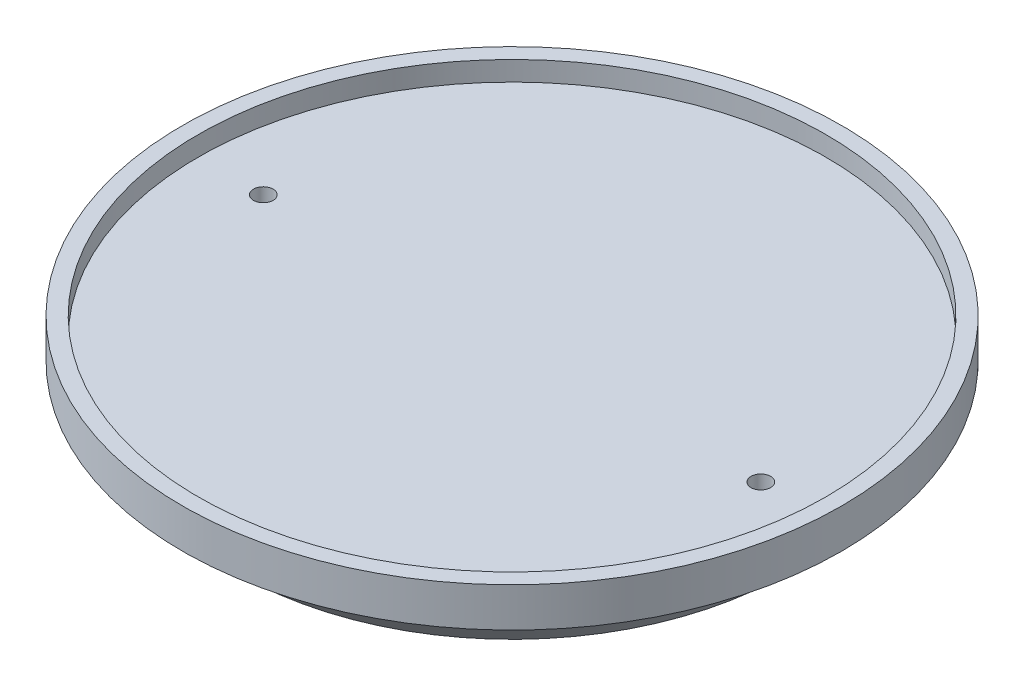
ISO-10303-21;
HEADER;
FILE_DESCRIPTION(('STEP AP214'),'2;1');
FILE_NAME('part.step','',(''),(''),'','','');
FILE_SCHEMA(('AUTOMOTIVE_DESIGN { 1 0 10303 214 1 1 1 1 }'));
ENDSEC;
DATA;
#1=APPLICATION_CONTEXT('core data for automotive mechanical design processes');
#2=APPLICATION_PROTOCOL_DEFINITION('international standard','automotive_design',2000,#1);
#3=PRODUCT_CONTEXT('',#1,'mechanical');
#4=PRODUCT('Part','Part','',(#3));
#5=PRODUCT_RELATED_PRODUCT_CATEGORY('part','',(#4));
#6=PRODUCT_DEFINITION_FORMATION('','',#4);
#7=PRODUCT_DEFINITION_CONTEXT('part definition',#1,'design');
#8=PRODUCT_DEFINITION('design','',#6,#7);
#9=PRODUCT_DEFINITION_SHAPE('','',#8);
#10=(LENGTH_UNIT() NAMED_UNIT(*) SI_UNIT(.MILLI.,.METRE.));
#11=(NAMED_UNIT(*) PLANE_ANGLE_UNIT() SI_UNIT($,.RADIAN.));
#12=(NAMED_UNIT(*) SI_UNIT($,.STERADIAN.) SOLID_ANGLE_UNIT());
#13=UNCERTAINTY_MEASURE_WITH_UNIT(LENGTH_MEASURE(1.E-05),#10,'distance_accuracy_value','');
#14=(GEOMETRIC_REPRESENTATION_CONTEXT(3) GLOBAL_UNCERTAINTY_ASSIGNED_CONTEXT((#13)) GLOBAL_UNIT_ASSIGNED_CONTEXT((#10,
#11,#12)) REPRESENTATION_CONTEXT('',''));
#15=CARTESIAN_POINT('',(0.,0.,0.));
#16=DIRECTION('',(0.,0.,1.));
#17=DIRECTION('',(1.,0.,0.));
#18=AXIS2_PLACEMENT_3D('',#15,#16,#17);
#19=CARTESIAN_POINT('',(-5.37688126181843E-13,-80.,0.));
#20=DIRECTION('',(0.,1.,0.));
#21=DIRECTION('',(1.,0.,0.));
#22=AXIS2_PLACEMENT_3D('',#19,#20,#21);
#23=CONICAL_SURFACE('',#22,40.,0.698131700797732);
#24=CARTESIAN_POINT('',(-48.6868752033916,-69.4518912178874,-4.00000000000002));
#25=CARTESIAN_POINT('',(-47.6568690535161,-70.6752766300763,-4.00000000000002));
#26=CARTESIAN_POINT('',(-46.6267404754821,-71.8985589970312,-4.00000000000002));
#27=CARTESIAN_POINT('',(-44.5661697906927,-74.3448598230297,-4.00000000000002));
#28=CARTESIAN_POINT('',(-43.5357276839089,-75.5678782820493,-4.00000000000002));
#29=CARTESIAN_POINT('',(-41.4744628292395,-78.0135916234675,-4.00000000000002));
#30=CARTESIAN_POINT('',(-40.4436400818631,-79.2362865062953,-4.00000000000001));
#31=CARTESIAN_POINT('',(-38.3815152336458,-81.6812719266257,-4.00000000000001));
#32=CARTESIAN_POINT('',(-37.3502131328224,-82.9035624641431,-4.00000000000001));
#33=CARTESIAN_POINT('',(-35.286996907068,-85.3476297225469,-4.00000000000001));
#34=CARTESIAN_POINT('',(-34.2550827813236,-86.5694064427466,-4.00000000000001));
#35=CARTESIAN_POINT('',(-32.1904591020132,-89.012287323864,-4.00000000000001));
#36=CARTESIAN_POINT('',(-31.1577495485822,-90.2333914848958,-4.00000000000001));
#37=CARTESIAN_POINT('',(-29.0912680269002,-92.6747035789984,-4.00000000000001));
#38=CARTESIAN_POINT('',(-28.0574960572165,-93.8949115108569,-4.00000000000001));
#39=CARTESIAN_POINT('',(-26.5057377348433,-95.7242906654193,-4.00000000000001));
#40=CARTESIAN_POINT('',(-25.9883014175911,-96.3339284343616,-4.00000000000001));
#41=CARTESIAN_POINT('',(-24.9529857973572,-97.5528278589746,-4.00000000000001));
#42=CARTESIAN_POINT('',(-24.4351064943044,-98.162089514585,-4.00000000000001));
#43=CARTESIAN_POINT('',(-23.9169676339321,-98.7711304746944,-4.00000000000001));
#44=B_SPLINE_CURVE_WITH_KNOTS('',3,(#24,#25,#26,#27,#28,#29,#30,#31,#32,#33,#34,#35,#36,#37,#38,
#39,#40,#41,#42,#43),.UNSPECIFIED.,.F.,.F.,(4,2,2,2,2,2,2,2,2,4),(0.,4.79773499487021,
9.59547042327023,14.3931994559658,19.1909283135978,23.9886635622491,28.7863979968774,
33.5841389093293,35.9830107408815,38.3818829574029),.UNSPECIFIED.);
#45=CARTESIAN_POINT('',(-39.7994974842653,-79.9999999999997,-4.00000000000002));
#46=VERTEX_POINT('',#45);
#47=CARTESIAN_POINT('',(-34.735851103902,-85.9999999999998,-4.00000000000001));
#48=VERTEX_POINT('',#47);
#49=EDGE_CURVE('E280',#46,#48,#44,.T.);
#50=ORIENTED_EDGE('',*,*,#49,.F.);
#51=CARTESIAN_POINT('',(-5.37688126181843E-13,-80.,0.));
#52=DIRECTION('',(0.,-1.,0.));
#53=DIRECTION('',(1.,0.,0.));
#54=AXIS2_PLACEMENT_3D('',#51,#52,#53);
#55=CIRCLE('',#54,40.);
#56=CARTESIAN_POINT('',(39.7994974842643,-80.0000000000003,-3.99999999999999));
#57=VERTEX_POINT('',#56);
#58=EDGE_CURVE('E357',#46,#57,#55,.T.);
#59=ORIENTED_EDGE('',*,*,#58,.T.);
#60=CARTESIAN_POINT('',(47.8454589806859,-70.4512258908506,-3.99999999999998));
#61=CARTESIAN_POINT('',(46.8153829381683,-71.6745529376641,-3.99999999999998));
#62=CARTESIAN_POINT('',(45.7851747124727,-72.8977686532785,-3.99999999999998));
#63=CARTESIAN_POINT('',(43.7244268522111,-75.3439208399644,-3.99999999999998));
#64=CARTESIAN_POINT('',(42.6938872176523,-76.5668573110419,-3.99999999999999));
#65=CARTESIAN_POINT('',(39.6016737313267,-80.2351593134204,-3.99999999999999));
#66=CARTESIAN_POINT('',(37.539402137361,-82.6800211870106,-3.99999999999999));
#67=CARTESIAN_POINT('',(34.4440515651146,-86.3456765534998,-4.));
#68=CARTESIAN_POINT('',(33.4119433561936,-87.5672897388675,-4.));
#69=CARTESIAN_POINT('',(31.3468666305888,-90.0097883864507,-4.));
#70=CARTESIAN_POINT('',(30.3138981140828,-91.2306738488165,-4.00000000000001));
#71=CARTESIAN_POINT('',(28.2468062882307,-93.6714703877273,-4.00000000000001));
#72=CARTESIAN_POINT('',(27.2126829770617,-94.8913814627289,-4.00000000000001));
#73=CARTESIAN_POINT('',(25.6602895900184,-96.7202231011329,-4.00000000000001));
#74=CARTESIAN_POINT('',(25.1426235438041,-97.3296663636415,-4.00000000000002));
#75=CARTESIAN_POINT('',(24.1068017808614,-98.5481368093262,-4.00000000000002));
#76=CARTESIAN_POINT('',(23.5886460640353,-99.1571639924193,-4.00000000000002));
#77=CARTESIAN_POINT('',(23.0702021236444,-99.7659458743681,-4.00000000000002));
#78=B_SPLINE_CURVE_WITH_KNOTS('',3,(#60,#61,#62,#63,#64,#65,#66,#67,#68,#69,#70,#71,#72,#73,#74,
#75,#76,#77),.UNSPECIFIED.,.F.,.F.,(4,2,2,2,2,2,2,2,4),(0.,4.79773600914051,9.59547191336659,
19.1909290038194,23.9886651773668,28.7864003595722,33.5841431256936,35.9830161795449,
38.3818897126936),.UNSPECIFIED.);
#79=CARTESIAN_POINT('',(34.7358511039009,-86.0000000000003,-4.));
#80=VERTEX_POINT('',#79);
#81=EDGE_CURVE('E319',#57,#80,#78,.T.);
#82=ORIENTED_EDGE('',*,*,#81,.T.);
#83=CARTESIAN_POINT('',(-5.7958590224796E-13,-86.,0.));
#84=DIRECTION('',(0.,-1.,0.));
#85=DIRECTION('',(1.,0.,0.));
#86=AXIS2_PLACEMENT_3D('',#83,#84,#85);
#87=CIRCLE('',#86,34.9654022129363);
#88=EDGE_CURVE('E333',#48,#80,#87,.T.);
#89=ORIENTED_EDGE('',*,*,#88,.F.);
#90=EDGE_LOOP('',(#50,#59,#82,#89));
#91=FACE_BOUND('',#90,.T.);
#92=ADVANCED_FACE('F34',(#91),#23,.T.);
#93=CARTESIAN_POINT('',(39.7994974842643,-80.0000000000003,4.));
#94=VERTEX_POINT('',#93);
#95=CARTESIAN_POINT('',(-39.7994974842653,-79.9999999999997,4.));
#96=VERTEX_POINT('',#95);
#97=EDGE_CURVE('E391',#94,#96,#55,.T.);
#98=ORIENTED_EDGE('',*,*,#97,.T.);
#99=CARTESIAN_POINT('',(-48.6868752033916,-69.4518912178874,3.99999999999999));
#100=CARTESIAN_POINT('',(-47.6568690535161,-70.6752766300763,3.99999999999999));
#101=CARTESIAN_POINT('',(-46.6267404754821,-71.8985589970312,3.99999999999999));
#102=CARTESIAN_POINT('',(-44.5661697906927,-74.3448598230297,3.99999999999999));
#103=CARTESIAN_POINT('',(-43.5357276839089,-75.5678782820493,4.));
#104=CARTESIAN_POINT('',(-41.4744628292395,-78.0135916234675,4.));
#105=CARTESIAN_POINT('',(-40.4436400818631,-79.2362865062953,4.));
#106=CARTESIAN_POINT('',(-38.3815152336458,-81.6812719266257,4.));
#107=CARTESIAN_POINT('',(-37.3502131328224,-82.9035624641431,4.));
#108=CARTESIAN_POINT('',(-35.286996907068,-85.3476297225469,4.));
#109=CARTESIAN_POINT('',(-34.2550827813236,-86.5694064427466,4.));
#110=CARTESIAN_POINT('',(-32.1904591020132,-89.012287323864,4.));
#111=CARTESIAN_POINT('',(-31.1577495485822,-90.2333914848958,4.));
#112=CARTESIAN_POINT('',(-29.0912680269002,-92.6747035789984,4.));
#113=CARTESIAN_POINT('',(-28.0574960572165,-93.8949115108569,4.));
#114=CARTESIAN_POINT('',(-26.5057377348433,-95.7242906654193,4.));
#115=CARTESIAN_POINT('',(-25.9883014175911,-96.3339284343616,4.));
#116=CARTESIAN_POINT('',(-24.9529857973572,-97.5528278589746,4.));
#117=CARTESIAN_POINT('',(-24.4351064943044,-98.162089514585,4.));
#118=CARTESIAN_POINT('',(-23.9169676339321,-98.7711304746944,4.));
#119=B_SPLINE_CURVE_WITH_KNOTS('',3,(#99,#100,#101,#102,#103,#104,#105,#106,#107,#108,#109,#110,
#111,#112,#113,#114,#115,#116,#117,#118),.UNSPECIFIED.,.F.,.F.,(4,2,2,2,2,2,2,2,2,4),(0.,
4.79773499487021,9.59547042327023,14.3931994559658,19.1909283135978,23.9886635622491,
28.7863979968774,33.5841389093293,35.9830107408815,38.3818829574029),.UNSPECIFIED.);
#120=CARTESIAN_POINT('',(-34.735851103902,-85.9999999999998,4.));
#121=VERTEX_POINT('',#120);
#122=EDGE_CURVE('E272',#96,#121,#119,.T.);
#123=ORIENTED_EDGE('',*,*,#122,.T.);
#124=CARTESIAN_POINT('',(34.7358511039009,-86.0000000000003,4.));
#125=VERTEX_POINT('',#124);
#126=EDGE_CURVE('E334',#125,#121,#87,.T.);
#127=ORIENTED_EDGE('',*,*,#126,.F.);
#128=CARTESIAN_POINT('',(47.8454589806859,-70.4512258908506,4.00000000000001));
#129=CARTESIAN_POINT('',(46.8153829381683,-71.6745529376641,4.00000000000001));
#130=CARTESIAN_POINT('',(45.7851747124727,-72.8977686532785,4.00000000000001));
#131=CARTESIAN_POINT('',(43.7244268522111,-75.3439208399643,4.00000000000001));
#132=CARTESIAN_POINT('',(42.6938872176523,-76.5668573110419,4.00000000000001));
#133=CARTESIAN_POINT('',(39.6016737313267,-80.2351593134204,4.));
#134=CARTESIAN_POINT('',(37.539402137361,-82.6800211870106,4.));
#135=CARTESIAN_POINT('',(34.4440515651146,-86.3456765534998,3.99999999999999));
#136=CARTESIAN_POINT('',(33.4119433561936,-87.5672897388675,3.99999999999999));
#137=CARTESIAN_POINT('',(31.3468666305888,-90.0097883864507,3.99999999999999));
#138=CARTESIAN_POINT('',(30.3138981140828,-91.2306738488165,3.99999999999999));
#139=CARTESIAN_POINT('',(28.2468062882307,-93.6714703877273,3.99999999999999));
#140=CARTESIAN_POINT('',(27.2126829770617,-94.8913814627289,3.99999999999998));
#141=CARTESIAN_POINT('',(25.6602895900184,-96.720223101133,3.99999999999998));
#142=CARTESIAN_POINT('',(25.1426235438041,-97.3296663636415,3.99999999999998));
#143=CARTESIAN_POINT('',(24.1068017808614,-98.5481368093263,3.99999999999998));
#144=CARTESIAN_POINT('',(23.5886460640353,-99.1571639924193,3.99999999999998));
#145=CARTESIAN_POINT('',(23.0702021236444,-99.7659458743681,3.99999999999998));
#146=B_SPLINE_CURVE_WITH_KNOTS('',3,(#128,#129,#130,#131,#132,#133,#134,#135,#136,#137,#138,
#139,#140,#141,#142,#143,#144,#145),.UNSPECIFIED.,.F.,.F.,(4,2,2,2,2,2,2,2,4),(0.,
4.7977360091405,9.59547191336659,19.1909290038195,23.9886651773668,28.7864003595723,
33.5841431256936,35.983016179545,38.3818897126937),.UNSPECIFIED.);
#147=EDGE_CURVE('E326',#94,#125,#146,.T.);
#148=ORIENTED_EDGE('',*,*,#147,.F.);
#149=EDGE_LOOP('',(#98,#123,#127,#148));
#150=FACE_BOUND('',#149,.T.);
#151=ADVANCED_FACE('F286',(#150),#23,.T.);
#152=CARTESIAN_POINT('',(-5.20230719487627E-13,-77.5,0.));
#153=DIRECTION('',(0.,-1.,0.));
#154=DIRECTION('',(1.,0.,0.));
#155=AXIS2_PLACEMENT_3D('',#152,#153,#154);
#156=PLANE('',#155);
#157=CARTESIAN_POINT('',(-31.7000000000005,-77.4999999999998,0.));
#158=DIRECTION('',(0.,-1.,0.));
#159=DIRECTION('',(1.,0.,0.));
#160=AXIS2_PLACEMENT_3D('',#157,#158,#159);
#161=CIRCLE('',#160,1.25);
#162=CARTESIAN_POINT('',(-30.4500000000005,-77.4999999999998,0.));
#163=VERTEX_POINT('',#162);
#164=EDGE_CURVE('E246',#163,#163,#161,.F.);
#165=ORIENTED_EDGE('',*,*,#164,.F.);
#166=EDGE_LOOP('',(#165));
#167=FACE_BOUND('',#166,.T.);
#168=CARTESIAN_POINT('',(31.6999999999995,-77.5000000000002,0.));
#169=DIRECTION('',(0.,-1.,0.));
#170=DIRECTION('',(1.,0.,0.));
#171=AXIS2_PLACEMENT_3D('',#168,#169,#170);
#172=CIRCLE('',#171,1.24999999999999);
#173=CARTESIAN_POINT('',(32.9499999999995,-77.5000000000002,0.));
#174=VERTEX_POINT('',#173);
#175=EDGE_CURVE('E252',#174,#174,#172,.F.);
#176=ORIENTED_EDGE('',*,*,#175,.F.);
#177=EDGE_LOOP('',(#176));
#178=FACE_BOUND('',#177,.T.);
#179=CARTESIAN_POINT('',(-5.20230719487627E-13,-77.5,0.));
#180=DIRECTION('',(0.,-1.,0.));
#181=DIRECTION('',(1.,0.,0.));
#182=AXIS2_PLACEMENT_3D('',#179,#180,#181);
#183=CIRCLE('',#182,40.);
#184=CARTESIAN_POINT('',(39.9999999999995,-77.5000000000003,0.));
#185=VERTEX_POINT('',#184);
#186=EDGE_CURVE('E386',#185,#185,#183,.T.);
#187=ORIENTED_EDGE('',*,*,#186,.F.);
#188=EDGE_LOOP('',(#187));
#189=FACE_BOUND('',#188,.T.);
#190=ADVANCED_FACE('F341',(#167,#178,#189),#156,.F.);
#191=CARTESIAN_POINT('',(-5.7958590224796E-13,-86.,0.));
#192=DIRECTION('',(0.,-1.,0.));
#193=DIRECTION('',(1.,0.,0.));
#194=AXIS2_PLACEMENT_3D('',#191,#192,#193);
#195=PLANE('',#194);
#196=DIRECTION('',(-1.,0.,0.));
#197=VECTOR('',#196,1.);
#198=CARTESIAN_POINT('',(-5.7958590224796E-13,-86.,-7.25));
#199=LINE('',#198,#197);
#200=CARTESIAN_POINT('',(17.5,-86.,-7.25));
#201=VERTEX_POINT('',#200);
#202=CARTESIAN_POINT('',(4.99999999999999,-86.,-7.25));
#203=VERTEX_POINT('',#202);
#204=EDGE_CURVE('E403',#201,#203,#199,.T.);
#205=ORIENTED_EDGE('',*,*,#204,.T.);
#206=DIRECTION('',(0.,0.,-1.));
#207=VECTOR('',#206,1.);
#208=CARTESIAN_POINT('',(4.99999999999999,-86.,1.25));
#209=LINE('',#208,#207);
#210=CARTESIAN_POINT('',(4.99999999999999,-86.,7.25));
#211=VERTEX_POINT('',#210);
#212=EDGE_CURVE('E228',#211,#203,#209,.T.);
#213=ORIENTED_EDGE('',*,*,#212,.F.);
#214=DIRECTION('',(-1.,0.,0.));
#215=VECTOR('',#214,1.);
#216=CARTESIAN_POINT('',(17.5,-86.0000000000001,7.25));
#217=LINE('',#216,#215);
#218=CARTESIAN_POINT('',(17.5,-86.,7.25));
#219=VERTEX_POINT('',#218);
#220=EDGE_CURVE('E400',#211,#219,#217,.F.);
#221=ORIENTED_EDGE('',*,*,#220,.T.);
#222=DIRECTION('',(0.,0.,-1.));
#223=VECTOR('',#222,1.);
#224=CARTESIAN_POINT('',(17.5,-86.,1.25));
#225=LINE('',#224,#223);
#226=EDGE_CURVE('E230',#219,#201,#225,.T.);
#227=ORIENTED_EDGE('',*,*,#226,.T.);
#228=EDGE_LOOP('',(#205,#213,#221,#227));
#229=FACE_BOUND('',#228,.T.);
#230=DIRECTION('',(-1.,0.,0.));
#231=VECTOR('',#230,1.);
#232=CARTESIAN_POINT('',(-5.7958590224796E-13,-86.,-7.25));
#233=LINE('',#232,#231);
#234=CARTESIAN_POINT('',(-5.00000000000001,-86.,-7.25));
#235=VERTEX_POINT('',#234);
#236=CARTESIAN_POINT('',(-17.5,-85.9999999999999,-7.25));
#237=VERTEX_POINT('',#236);
#238=EDGE_CURVE('E405',#235,#237,#233,.T.);
#239=ORIENTED_EDGE('',*,*,#238,.T.);
#240=DIRECTION('',(0.,0.,-1.));
#241=VECTOR('',#240,1.);
#242=CARTESIAN_POINT('',(-17.5,-86.,1.25));
#243=LINE('',#242,#241);
#244=CARTESIAN_POINT('',(-17.5,-85.9999999999999,7.25));
#245=VERTEX_POINT('',#244);
#246=EDGE_CURVE('E192',#245,#237,#243,.T.);
#247=ORIENTED_EDGE('',*,*,#246,.F.);
#248=DIRECTION('',(-1.,0.,0.));
#249=VECTOR('',#248,1.);
#250=CARTESIAN_POINT('',(-5.00000000000001,-86.,7.25));
#251=LINE('',#250,#249);
#252=CARTESIAN_POINT('',(-5.00000000000001,-86.,7.25));
#253=VERTEX_POINT('',#252);
#254=EDGE_CURVE('E397',#245,#253,#251,.F.);
#255=ORIENTED_EDGE('',*,*,#254,.T.);
#256=DIRECTION('',(0.,0.,-1.));
#257=VECTOR('',#256,1.);
#258=CARTESIAN_POINT('',(-5.00000000000001,-86.,1.25));
#259=LINE('',#258,#257);
#260=EDGE_CURVE('E208',#253,#235,#259,.T.);
#261=ORIENTED_EDGE('',*,*,#260,.T.);
#262=EDGE_LOOP('',(#239,#247,#255,#261));
#263=FACE_BOUND('',#262,.T.);
#264=CARTESIAN_POINT('',(-31.7000000000006,-85.9999999999998,0.));
#265=DIRECTION('',(0.,-1.,0.));
#266=DIRECTION('',(1.,0.,0.));
#267=AXIS2_PLACEMENT_3D('',#264,#265,#266);
#268=CIRCLE('',#267,4.00000000000001);
#269=CARTESIAN_POINT('',(-31.7000000000006,-85.9999999999998,-4.00000000000001));
#270=VERTEX_POINT('',#269);
#271=CARTESIAN_POINT('',(-31.7000000000005,-85.9999999999998,4.));
#272=VERTEX_POINT('',#271);
#273=EDGE_CURVE('E256',#270,#272,#268,.T.);
#274=ORIENTED_EDGE('',*,*,#273,.F.);
#275=DIRECTION('',(-1.,0.,0.));
#276=VECTOR('',#275,1.);
#277=CARTESIAN_POINT('',(-5.77872488812772E-13,-86.,-4.));
#278=LINE('',#277,#276);
#279=EDGE_CURVE('E395',#270,#48,#278,.T.);
#280=ORIENTED_EDGE('',*,*,#279,.T.);
#281=ORIENTED_EDGE('',*,*,#88,.T.);
#282=DIRECTION('',(1.,0.,0.));
#283=VECTOR('',#282,1.);
#284=CARTESIAN_POINT('',(-5.72732248507206E-13,-86.,-4.00000000000006));
#285=LINE('',#284,#283);
#286=CARTESIAN_POINT('',(31.6999999999994,-86.0000000000002,-4.));
#287=VERTEX_POINT('',#286);
#288=EDGE_CURVE('E383',#287,#80,#285,.T.);
#289=ORIENTED_EDGE('',*,*,#288,.F.);
#290=CARTESIAN_POINT('',(31.6999999999994,-86.0000000000002,0.));
#291=DIRECTION('',(0.,-1.,0.));
#292=DIRECTION('',(1.,0.,0.));
#293=AXIS2_PLACEMENT_3D('',#290,#291,#292);
#294=CIRCLE('',#293,4.);
#295=CARTESIAN_POINT('',(31.6999999999994,-86.0000000000002,3.99999999999999));
#296=VERTEX_POINT('',#295);
#297=EDGE_CURVE('E370',#296,#287,#294,.T.);
#298=ORIENTED_EDGE('',*,*,#297,.F.);
#299=DIRECTION('',(1.,0.,0.));
#300=VECTOR('',#299,1.);
#301=CARTESIAN_POINT('',(-5.85154495912323E-13,-86.,3.99999999999995));
#302=LINE('',#301,#300);
#303=EDGE_CURVE('E385',#296,#125,#302,.T.);
#304=ORIENTED_EDGE('',*,*,#303,.T.);
#305=ORIENTED_EDGE('',*,*,#126,.T.);
#306=DIRECTION('',(-1.,0.,0.));
#307=VECTOR('',#306,1.);
#308=CARTESIAN_POINT('',(-5.80870962324352E-13,-86.,4.00000000000001));
#309=LINE('',#308,#307);
#310=EDGE_CURVE('E388',#272,#121,#309,.T.);
#311=ORIENTED_EDGE('',*,*,#310,.F.);
#312=EDGE_LOOP('',(#274,#280,#281,#289,#298,#304,#305,#311));
#313=FACE_BOUND('',#312,.T.);
#314=ADVANCED_FACE('F338',(#229,#263,#313),#195,.T.);
#315=CARTESIAN_POINT('',(-6.11327194349913E-13,-86.,3.99999999999995));
#316=DIRECTION('',(0.,0.,-1.));
#317=DIRECTION('',(-1.,0.,0.));
#318=AXIS2_PLACEMENT_3D('',#315,#316,#317);
#319=PLANE('',#318);
#320=ORIENTED_EDGE('',*,*,#147,.T.);
#321=ORIENTED_EDGE('',*,*,#303,.F.);
#322=DIRECTION('',(0.,1.,0.));
#323=VECTOR('',#322,1.);
#324=CARTESIAN_POINT('',(31.6999999999994,-86.0000000000002,3.99999999999999));
#325=LINE('',#324,#323);
#326=CARTESIAN_POINT('',(31.6999999999995,-80.0000000000002,3.99999999999999));
#327=VERTEX_POINT('',#326);
#328=EDGE_CURVE('E327',#296,#327,#325,.T.);
#329=ORIENTED_EDGE('',*,*,#328,.T.);
#330=DIRECTION('',(-1.,0.,0.));
#331=VECTOR('',#330,1.);
#332=CARTESIAN_POINT('',(-5.69429418283795E-13,-80.,3.99999999999995));
#333=LINE('',#332,#331);
#334=EDGE_CURVE('E361',#94,#327,#333,.T.);
#335=ORIENTED_EDGE('',*,*,#334,.F.);
#336=EDGE_LOOP('',(#320,#321,#329,#335));
#337=FACE_BOUND('',#336,.T.);
#338=ADVANCED_FACE('F315',(#337),#319,.T.);
#339=CARTESIAN_POINT('',(-5.98904946944796E-13,-86.,-4.00000000000006));
#340=DIRECTION('',(0.,0.,-1.));
#341=DIRECTION('',(-1.,0.,0.));
#342=AXIS2_PLACEMENT_3D('',#339,#340,#341);
#343=PLANE('',#342);
#344=DIRECTION('',(-1.,0.,0.));
#345=VECTOR('',#344,1.);
#346=CARTESIAN_POINT('',(-5.57007170878679E-13,-80.,-4.00000000000006));
#347=LINE('',#346,#345);
#348=CARTESIAN_POINT('',(31.6999999999995,-80.0000000000002,-4.));
#349=VERTEX_POINT('',#348);
#350=EDGE_CURVE('E368',#57,#349,#347,.T.);
#351=ORIENTED_EDGE('',*,*,#350,.T.);
#352=DIRECTION('',(0.,1.,0.));
#353=VECTOR('',#352,1.);
#354=CARTESIAN_POINT('',(31.6999999999994,-86.0000000000002,-4.));
#355=LINE('',#354,#353);
#356=EDGE_CURVE('E373',#287,#349,#355,.T.);
#357=ORIENTED_EDGE('',*,*,#356,.F.);
#358=ORIENTED_EDGE('',*,*,#288,.T.);
#359=ORIENTED_EDGE('',*,*,#81,.F.);
#360=EDGE_LOOP('',(#351,#357,#358,#359));
#361=FACE_BOUND('',#360,.T.);
#362=ADVANCED_FACE('F311',(#361),#343,.F.);
#363=CARTESIAN_POINT('',(31.6999999999994,-86.0000000000002,0.));
#364=DIRECTION('',(0.,1.,0.));
#365=DIRECTION('',(-1.,0.,0.));
#366=AXIS2_PLACEMENT_3D('',#363,#364,#365);
#367=CYLINDRICAL_SURFACE('',#366,4.);
#368=CARTESIAN_POINT('',(31.6999999999995,-80.0000000000002,0.));
#369=DIRECTION('',(0.,-1.,0.));
#370=DIRECTION('',(1.,0.,0.));
#371=AXIS2_PLACEMENT_3D('',#368,#369,#370);
#372=CIRCLE('',#371,4.);
#373=EDGE_CURVE('E363',#327,#349,#372,.T.);
#374=ORIENTED_EDGE('',*,*,#373,.F.);
#375=ORIENTED_EDGE('',*,*,#328,.F.);
#376=ORIENTED_EDGE('',*,*,#297,.T.);
#377=ORIENTED_EDGE('',*,*,#356,.T.);
#378=EDGE_LOOP('',(#374,#375,#376,#377));
#379=FACE_BOUND('',#378,.T.);
#380=ADVANCED_FACE('F309',(#379),#367,.F.);
#381=CARTESIAN_POINT('',(-5.63860824619433E-13,-80.,0.));
#382=DIRECTION('',(0.,-1.,0.));
#383=DIRECTION('',(1.,0.,0.));
#384=AXIS2_PLACEMENT_3D('',#381,#382,#383);
#385=PLANE('',#384);
#386=CARTESIAN_POINT('',(31.6999999999995,-80.0000000000002,0.));
#387=DIRECTION('',(0.,-1.,0.));
#388=DIRECTION('',(1.,0.,0.));
#389=AXIS2_PLACEMENT_3D('',#386,#387,#388);
#390=CIRCLE('',#389,1.24999999999999);
#391=CARTESIAN_POINT('',(32.9499999999995,-80.0000000000002,0.));
#392=VERTEX_POINT('',#391);
#393=EDGE_CURVE('E249',#392,#392,#390,.F.);
#394=ORIENTED_EDGE('',*,*,#393,.T.);
#395=EDGE_LOOP('',(#394));
#396=FACE_BOUND('',#395,.T.);
#397=ORIENTED_EDGE('',*,*,#334,.T.);
#398=ORIENTED_EDGE('',*,*,#373,.T.);
#399=ORIENTED_EDGE('',*,*,#350,.F.);
#400=ORIENTED_EDGE('',*,*,#58,.F.);
#401=DIRECTION('',(1.,0.,0.));
#402=VECTOR('',#401,1.);
#403=CARTESIAN_POINT('',(-5.62147411184244E-13,-80.,-4.));
#404=LINE('',#403,#402);
#405=CARTESIAN_POINT('',(-31.7000000000005,-79.9999999999998,-4.00000000000001));
#406=VERTEX_POINT('',#405);
#407=EDGE_CURVE('E255',#46,#406,#404,.T.);
#408=ORIENTED_EDGE('',*,*,#407,.T.);
#409=CARTESIAN_POINT('',(-31.7000000000005,-79.9999999999998,0.));
#410=DIRECTION('',(0.,-1.,0.));
#411=DIRECTION('',(1.,0.,0.));
#412=AXIS2_PLACEMENT_3D('',#409,#410,#411);
#413=CIRCLE('',#412,4.00000000000001);
#414=CARTESIAN_POINT('',(-31.7000000000005,-79.9999999999998,4.));
#415=VERTEX_POINT('',#414);
#416=EDGE_CURVE('E263',#406,#415,#413,.T.);
#417=ORIENTED_EDGE('',*,*,#416,.T.);
#418=DIRECTION('',(1.,0.,0.));
#419=VECTOR('',#418,1.);
#420=CARTESIAN_POINT('',(-5.65145884695824E-13,-80.,4.00000000000001));
#421=LINE('',#420,#419);
#422=EDGE_CURVE('E260',#96,#415,#421,.T.);
#423=ORIENTED_EDGE('',*,*,#422,.F.);
#424=ORIENTED_EDGE('',*,*,#97,.F.);
#425=EDGE_LOOP('',(#397,#398,#399,#400,#408,#417,#423,#424));
#426=FACE_BOUND('',#425,.T.);
#427=CARTESIAN_POINT('',(-31.7000000000005,-79.9999999999998,0.));
#428=DIRECTION('',(0.,-1.,0.));
#429=DIRECTION('',(1.,0.,0.));
#430=AXIS2_PLACEMENT_3D('',#427,#428,#429);
#431=CIRCLE('',#430,1.25);
#432=CARTESIAN_POINT('',(-30.4500000000005,-79.9999999999998,0.));
#433=VERTEX_POINT('',#432);
#434=EDGE_CURVE('E241',#433,#433,#431,.F.);
#435=ORIENTED_EDGE('',*,*,#434,.T.);
#436=EDGE_LOOP('',(#435));
#437=FACE_BOUND('',#436,.T.);
#438=CARTESIAN_POINT('',(-5.34294830600857E-13,-80.,0.));
#439=DIRECTION('',(0.,-1.,0.));
#440=DIRECTION('',(1.,0.,0.));
#441=AXIS2_PLACEMENT_3D('',#438,#439,#440);
#442=CIRCLE('',#441,42.);
#443=CARTESIAN_POINT('',(41.9999999999995,-80.0000000000003,0.));
#444=VERTEX_POINT('',#443);
#445=EDGE_CURVE('E234',#444,#444,#442,.T.);
#446=ORIENTED_EDGE('',*,*,#445,.T.);
#447=EDGE_LOOP('',(#446));
#448=FACE_BOUND('',#447,.T.);
#449=ADVANCED_FACE('F305',(#396,#426,#437,#448),#385,.T.);
#450=CARTESIAN_POINT('',(-6.04045187250362E-13,-86.,-4.));
#451=DIRECTION('',(0.,0.,1.));
#452=DIRECTION('',(1.,0.,0.));
#453=AXIS2_PLACEMENT_3D('',#450,#451,#452);
#454=PLANE('',#453);
#455=ORIENTED_EDGE('',*,*,#49,.T.);
#456=ORIENTED_EDGE('',*,*,#279,.F.);
#457=DIRECTION('',(0.,1.,0.));
#458=VECTOR('',#457,1.);
#459=CARTESIAN_POINT('',(-31.7000000000006,-85.9999999999998,-4.00000000000001));
#460=LINE('',#459,#458);
#461=EDGE_CURVE('E269',#270,#406,#460,.T.);
#462=ORIENTED_EDGE('',*,*,#461,.T.);
#463=ORIENTED_EDGE('',*,*,#407,.F.);
#464=EDGE_LOOP('',(#455,#456,#462,#463));
#465=FACE_BOUND('',#464,.T.);
#466=ADVANCED_FACE('F296',(#465),#454,.T.);
#467=CARTESIAN_POINT('',(-6.07043660761942E-13,-86.,4.00000000000001));
#468=DIRECTION('',(0.,0.,1.));
#469=DIRECTION('',(1.,0.,0.));
#470=AXIS2_PLACEMENT_3D('',#467,#468,#469);
#471=PLANE('',#470);
#472=ORIENTED_EDGE('',*,*,#422,.T.);
#473=DIRECTION('',(0.,1.,0.));
#474=VECTOR('',#473,1.);
#475=CARTESIAN_POINT('',(-31.7000000000006,-85.9999999999998,4.));
#476=LINE('',#475,#474);
#477=EDGE_CURVE('E259',#272,#415,#476,.T.);
#478=ORIENTED_EDGE('',*,*,#477,.F.);
#479=ORIENTED_EDGE('',*,*,#310,.T.);
#480=ORIENTED_EDGE('',*,*,#122,.F.);
#481=EDGE_LOOP('',(#472,#478,#479,#480));
#482=FACE_BOUND('',#481,.T.);
#483=ADVANCED_FACE('F290',(#482),#471,.F.);
#484=CARTESIAN_POINT('',(-31.7000000000006,-85.9999999999998,0.));
#485=DIRECTION('',(0.,1.,0.));
#486=DIRECTION('',(-1.,0.,0.));
#487=AXIS2_PLACEMENT_3D('',#484,#485,#486);
#488=CYLINDRICAL_SURFACE('',#487,4.00000000000001);
#489=ORIENTED_EDGE('',*,*,#416,.F.);
#490=ORIENTED_EDGE('',*,*,#461,.F.);
#491=ORIENTED_EDGE('',*,*,#273,.T.);
#492=ORIENTED_EDGE('',*,*,#477,.T.);
#493=EDGE_LOOP('',(#489,#490,#491,#492));
#494=FACE_BOUND('',#493,.T.);
#495=ADVANCED_FACE('F295',(#494),#488,.F.);
#496=CARTESIAN_POINT('',(31.6999999999994,-86.0000000000008,0.));
#497=DIRECTION('',(0.,1.,0.));
#498=DIRECTION('',(-1.,0.,0.));
#499=AXIS2_PLACEMENT_3D('',#496,#497,#498);
#500=CYLINDRICAL_SURFACE('',#499,1.24999999999999);
#501=ORIENTED_EDGE('',*,*,#393,.F.);
#502=EDGE_LOOP('',(#501));
#503=FACE_BOUND('',#502,.T.);
#504=ORIENTED_EDGE('',*,*,#175,.T.);
#505=EDGE_LOOP('',(#504));
#506=FACE_BOUND('',#505,.T.);
#507=ADVANCED_FACE('F298',(#503,#506),#500,.F.);
#508=CARTESIAN_POINT('',(-31.7000000000006,-86.0000000000003,0.));
#509=DIRECTION('',(0.,1.,0.));
#510=DIRECTION('',(-1.,0.,0.));
#511=AXIS2_PLACEMENT_3D('',#508,#509,#510);
#512=CYLINDRICAL_SURFACE('',#511,1.25);
#513=ORIENTED_EDGE('',*,*,#434,.F.);
#514=EDGE_LOOP('',(#513));
#515=FACE_BOUND('',#514,.T.);
#516=ORIENTED_EDGE('',*,*,#164,.T.);
#517=EDGE_LOOP('',(#516));
#518=FACE_BOUND('',#517,.T.);
#519=ADVANCED_FACE('F484',(#515,#518),#512,.F.);
#520=CARTESIAN_POINT('',(-5.02773312793411E-13,-75.,0.));
#521=DIRECTION('',(0.,-1.,0.));
#522=DIRECTION('',(1.,0.,0.));
#523=AXIS2_PLACEMENT_3D('',#520,#521,#522);
#524=CYLINDRICAL_SURFACE('',#523,40.);
#525=CARTESIAN_POINT('',(-5.02773312793411E-13,-75.,0.));
#526=DIRECTION('',(0.,-1.,0.));
#527=DIRECTION('',(1.,0.,0.));
#528=AXIS2_PLACEMENT_3D('',#525,#526,#527);
#529=CIRCLE('',#528,40.);
#530=CARTESIAN_POINT('',(39.9999999999995,-75.0000000000003,0.));
#531=VERTEX_POINT('',#530);
#532=EDGE_CURVE('E235',#531,#531,#529,.T.);
#533=ORIENTED_EDGE('',*,*,#532,.F.);
#534=EDGE_LOOP('',(#533));
#535=FACE_BOUND('',#534,.T.);
#536=ORIENTED_EDGE('',*,*,#186,.T.);
#537=EDGE_LOOP('',(#536));
#538=FACE_BOUND('',#537,.T.);
#539=ADVANCED_FACE('F481',(#535,#538),#524,.F.);
#540=CARTESIAN_POINT('',(-4.99380017212425E-13,-75.,0.));
#541=DIRECTION('',(0.,-1.,0.));
#542=DIRECTION('',(1.,0.,0.));
#543=AXIS2_PLACEMENT_3D('',#540,#541,#542);
#544=CYLINDRICAL_SURFACE('',#543,42.);
#545=CARTESIAN_POINT('',(-4.99380017212425E-13,-75.,0.));
#546=DIRECTION('',(0.,-1.,0.));
#547=DIRECTION('',(1.,0.,0.));
#548=AXIS2_PLACEMENT_3D('',#545,#546,#547);
#549=CIRCLE('',#548,42.);
#550=CARTESIAN_POINT('',(41.9999999999995,-75.0000000000003,0.));
#551=VERTEX_POINT('',#550);
#552=EDGE_CURVE('E238',#551,#551,#549,.T.);
#553=ORIENTED_EDGE('',*,*,#552,.T.);
#554=EDGE_LOOP('',(#553));
#555=FACE_BOUND('',#554,.T.);
#556=ORIENTED_EDGE('',*,*,#445,.F.);
#557=EDGE_LOOP('',(#556));
#558=FACE_BOUND('',#557,.T.);
#559=ADVANCED_FACE('F477',(#555,#558),#544,.T.);
#560=CARTESIAN_POINT('',(-5.28946011231001E-13,-75.,0.));
#561=DIRECTION('',(0.,-1.,0.));
#562=DIRECTION('',(1.,0.,0.));
#563=AXIS2_PLACEMENT_3D('',#560,#561,#562);
#564=PLANE('',#563);
#565=ORIENTED_EDGE('',*,*,#532,.T.);
#566=EDGE_LOOP('',(#565));
#567=FACE_BOUND('',#566,.T.);
#568=ORIENTED_EDGE('',*,*,#552,.F.);
#569=EDGE_LOOP('',(#568));
#570=FACE_BOUND('',#569,.T.);
#571=ADVANCED_FACE('F474',(#567,#570),#564,.F.);
#572=CARTESIAN_POINT('',(-17.5,-86.,1.25));
#573=DIRECTION('',(0.710179634793896,0.704020515556193,0.));
#574=DIRECTION('',(-0.704020515556193,0.710179634793896,0.));
#575=AXIS2_PLACEMENT_3D('',#572,#573,#574);
#576=PLANE('',#575);
#577=ORIENTED_EDGE('',*,*,#246,.T.);
#578=CARTESIAN_POINT('',(-11.5520357295756,-91.9999999999999,-7.25));
#579=DIRECTION('',(0.710179634793896,0.704020515556193,0.));
#580=DIRECTION('',(-0.704020515556193,0.710179634793896,0.));
#581=AXIS2_PLACEMENT_3D('',#578,#579,#580);
#582=ELLIPSE('',#581,8.44856668093746,6.);
#583=CARTESIAN_POINT('',(-11.5520357295756,-91.9999999999999,-1.25));
#584=VERTEX_POINT('',#583);
#585=EDGE_CURVE('E415',#237,#584,#582,.T.);
#586=ORIENTED_EDGE('',*,*,#585,.T.);
#587=DIRECTION('',(0.704020515556193,-0.710179634793896,0.));
#588=VECTOR('',#587,1.);
#589=CARTESIAN_POINT('',(-17.5,-86.,-1.25));
#590=LINE('',#589,#588);
#591=CARTESIAN_POINT('',(-5.32634726095428,-98.2801538666711,-1.25));
#592=VERTEX_POINT('',#591);
#593=EDGE_CURVE('E189',#584,#592,#590,.T.);
#594=ORIENTED_EDGE('',*,*,#593,.T.);
#595=DIRECTION('',(0.,0.,-1.));
#596=VECTOR('',#595,1.);
#597=CARTESIAN_POINT('',(-5.32634726095428,-98.2801538666711,1.25));
#598=LINE('',#597,#596);
#599=CARTESIAN_POINT('',(-5.32634726095428,-98.2801538666711,1.25));
#600=VERTEX_POINT('',#599);
#601=EDGE_CURVE('E186',#600,#592,#598,.T.);
#602=ORIENTED_EDGE('',*,*,#601,.F.);
#603=DIRECTION('',(0.704020515556193,-0.710179634793896,0.));
#604=VECTOR('',#603,1.);
#605=CARTESIAN_POINT('',(-17.5,-86.,1.25));
#606=LINE('',#605,#604);
#607=CARTESIAN_POINT('',(-11.5520357295756,-91.9999999999999,1.25));
#608=VERTEX_POINT('',#607);
#609=EDGE_CURVE('E172',#608,#600,#606,.T.);
#610=ORIENTED_EDGE('',*,*,#609,.F.);
#611=CARTESIAN_POINT('',(-11.5520357295756,-91.9999999999999,7.25));
#612=DIRECTION('',(0.710179634793896,0.704020515556193,0.));
#613=DIRECTION('',(0.704020515556193,-0.710179634793896,0.));
#614=AXIS2_PLACEMENT_3D('',#611,#612,#613);
#615=ELLIPSE('',#614,8.44856668093746,6.);
#616=EDGE_CURVE('E42',#608,#245,#615,.T.);
#617=ORIENTED_EDGE('',*,*,#616,.T.);
#618=EDGE_LOOP('',(#577,#586,#594,#602,#610,#617));
#619=FACE_BOUND('',#618,.T.);
#620=ADVANCED_FACE('F187',(#619),#576,.F.);
#621=CARTESIAN_POINT('',(0.,-92.9999999999997,1.25));
#622=DIRECTION('',(0.,0.,-1.));
#623=DIRECTION('',(-1.,0.,0.));
#624=AXIS2_PLACEMENT_3D('',#621,#622,#623);
#625=CYLINDRICAL_SURFACE('',#624,7.5);
#626=CARTESIAN_POINT('',(0.,-92.9999999999997,-1.25));
#627=DIRECTION('',(0.,0.,1.));
#628=DIRECTION('',(1.,0.,0.));
#629=AXIS2_PLACEMENT_3D('',#626,#627,#628);
#630=CIRCLE('',#629,7.5);
#631=CARTESIAN_POINT('',(5.32634726095427,-98.2801538666712,-1.25));
#632=VERTEX_POINT('',#631);
#633=EDGE_CURVE('E210',#592,#632,#630,.T.);
#634=ORIENTED_EDGE('',*,*,#633,.T.);
#635=DIRECTION('',(0.,0.,-1.));
#636=VECTOR('',#635,1.);
#637=CARTESIAN_POINT('',(5.32634726095427,-98.2801538666712,1.25));
#638=LINE('',#637,#636);
#639=CARTESIAN_POINT('',(5.32634726095427,-98.2801538666712,1.25));
#640=VERTEX_POINT('',#639);
#641=EDGE_CURVE('E193',#640,#632,#638,.T.);
#642=ORIENTED_EDGE('',*,*,#641,.F.);
#643=CARTESIAN_POINT('',(0.,-92.9999999999997,1.25));
#644=DIRECTION('',(0.,0.,1.));
#645=DIRECTION('',(1.,0.,0.));
#646=AXIS2_PLACEMENT_3D('',#643,#644,#645);
#647=CIRCLE('',#646,7.5);
#648=EDGE_CURVE('E177',#600,#640,#647,.T.);
#649=ORIENTED_EDGE('',*,*,#648,.F.);
#650=ORIENTED_EDGE('',*,*,#601,.T.);
#651=EDGE_LOOP('',(#634,#642,#649,#650));
#652=FACE_BOUND('',#651,.T.);
#653=ADVANCED_FACE('F195',(#652),#625,.T.);
#654=CARTESIAN_POINT('',(17.5,-86.,1.25));
#655=DIRECTION('',(-0.710179634793895,0.704020515556194,0.));
#656=DIRECTION('',(-0.704020515556194,-0.710179634793895,0.));
#657=AXIS2_PLACEMENT_3D('',#654,#655,#656);
#658=PLANE('',#657);
#659=DIRECTION('',(0.704020515556194,0.710179634793895,0.));
#660=VECTOR('',#659,1.);
#661=CARTESIAN_POINT('',(17.5,-86.,-1.25));
#662=LINE('',#661,#660);
#663=CARTESIAN_POINT('',(11.5520357295755,-92.0000000000001,-1.25));
#664=VERTEX_POINT('',#663);
#665=EDGE_CURVE('E212',#632,#664,#662,.T.);
#666=ORIENTED_EDGE('',*,*,#665,.T.);
#667=CARTESIAN_POINT('',(11.5520357295755,-92.0000000000001,-7.25));
#668=DIRECTION('',(-0.710179634793895,0.704020515556194,0.));
#669=DIRECTION('',(-0.704020515556194,-0.710179634793895,0.));
#670=AXIS2_PLACEMENT_3D('',#667,#668,#669);
#671=ELLIPSE('',#670,8.44856668093735,6.);
#672=EDGE_CURVE('E422',#664,#201,#671,.T.);
#673=ORIENTED_EDGE('',*,*,#672,.T.);
#674=ORIENTED_EDGE('',*,*,#226,.F.);
#675=CARTESIAN_POINT('',(11.5520357295755,-92.0000000000001,7.25));
#676=DIRECTION('',(-0.710179634793895,0.704020515556194,0.));
#677=DIRECTION('',(0.704020515556194,0.710179634793895,0.));
#678=AXIS2_PLACEMENT_3D('',#675,#676,#677);
#679=ELLIPSE('',#678,8.44856668093735,6.);
#680=CARTESIAN_POINT('',(11.5520357295755,-92.0000000000001,1.25));
#681=VERTEX_POINT('',#680);
#682=EDGE_CURVE('E426',#219,#681,#679,.T.);
#683=ORIENTED_EDGE('',*,*,#682,.T.);
#684=DIRECTION('',(0.704020515556194,0.710179634793895,0.));
#685=VECTOR('',#684,1.);
#686=CARTESIAN_POINT('',(17.5,-86.,1.25));
#687=LINE('',#686,#685);
#688=EDGE_CURVE('E198',#640,#681,#687,.T.);
#689=ORIENTED_EDGE('',*,*,#688,.F.);
#690=ORIENTED_EDGE('',*,*,#641,.T.);
#691=EDGE_LOOP('',(#666,#673,#674,#683,#689,#690));
#692=FACE_BOUND('',#691,.T.);
#693=ADVANCED_FACE('F440',(#692),#658,.F.);
#694=CARTESIAN_POINT('',(4.99999999999999,-92.9999999999997,1.25));
#695=DIRECTION('',(1.,0.,0.));
#696=DIRECTION('',(0.,1.,0.));
#697=AXIS2_PLACEMENT_3D('',#694,#695,#696);
#698=PLANE('',#697);
#699=ORIENTED_EDGE('',*,*,#212,.T.);
#700=CARTESIAN_POINT('',(4.99999999999999,-92.0000000000001,-7.25));
#701=DIRECTION('',(1.,0.,0.));
#702=DIRECTION('',(0.,1.,0.));
#703=AXIS2_PLACEMENT_3D('',#700,#701,#702);
#704=CIRCLE('',#703,6.);
#705=CARTESIAN_POINT('',(4.99999999999999,-92.0000000000001,-1.25));
#706=VERTEX_POINT('',#705);
#707=EDGE_CURVE('E420',#203,#706,#704,.T.);
#708=ORIENTED_EDGE('',*,*,#707,.T.);
#709=DIRECTION('',(0.,-1.,0.));
#710=VECTOR('',#709,1.);
#711=CARTESIAN_POINT('',(4.99999999999999,-92.9999999999997,-1.25));
#712=LINE('',#711,#710);
#713=CARTESIAN_POINT('',(4.99999999999999,-92.9999999999997,-1.25));
#714=VERTEX_POINT('',#713);
#715=EDGE_CURVE('E215',#706,#714,#712,.T.);
#716=ORIENTED_EDGE('',*,*,#715,.T.);
#717=DIRECTION('',(0.,0.,-1.));
#718=VECTOR('',#717,1.);
#719=CARTESIAN_POINT('',(4.99999999999999,-92.9999999999997,1.25));
#720=LINE('',#719,#718);
#721=CARTESIAN_POINT('',(4.99999999999999,-92.9999999999997,1.25));
#722=VERTEX_POINT('',#721);
#723=EDGE_CURVE('E225',#722,#714,#720,.T.);
#724=ORIENTED_EDGE('',*,*,#723,.F.);
#725=DIRECTION('',(0.,-1.,0.));
#726=VECTOR('',#725,1.);
#727=CARTESIAN_POINT('',(4.99999999999999,-92.9999999999997,1.25));
#728=LINE('',#727,#726);
#729=CARTESIAN_POINT('',(4.99999999999999,-92.0000000000001,1.25));
#730=VERTEX_POINT('',#729);
#731=EDGE_CURVE('E200',#730,#722,#728,.T.);
#732=ORIENTED_EDGE('',*,*,#731,.F.);
#733=CARTESIAN_POINT('',(4.99999999999999,-92.0000000000001,7.25));
#734=DIRECTION('',(1.,0.,0.));
#735=DIRECTION('',(0.,1.,0.));
#736=AXIS2_PLACEMENT_3D('',#733,#734,#735);
#737=CIRCLE('',#736,6.);
#738=EDGE_CURVE('E55',#730,#211,#737,.T.);
#739=ORIENTED_EDGE('',*,*,#738,.T.);
#740=EDGE_LOOP('',(#699,#708,#716,#724,#732,#739));
#741=FACE_BOUND('',#740,.T.);
#742=ADVANCED_FACE('F448',(#741),#698,.F.);
#743=CARTESIAN_POINT('',(0.,-92.9999999999997,1.25));
#744=DIRECTION('',(0.,0.,-1.));
#745=DIRECTION('',(-1.,0.,0.));
#746=AXIS2_PLACEMENT_3D('',#743,#744,#745);
#747=CYLINDRICAL_SURFACE('',#746,5.);
#748=CARTESIAN_POINT('',(0.,-92.9999999999997,-1.25));
#749=DIRECTION('',(0.,0.,-1.));
#750=DIRECTION('',(1.,0.,0.));
#751=AXIS2_PLACEMENT_3D('',#748,#749,#750);
#752=CIRCLE('',#751,5.);
#753=CARTESIAN_POINT('',(-5.00000000000001,-92.9999999999997,-1.25));
#754=VERTEX_POINT('',#753);
#755=EDGE_CURVE('E217',#714,#754,#752,.T.);
#756=ORIENTED_EDGE('',*,*,#755,.T.);
#757=DIRECTION('',(0.,0.,-1.));
#758=VECTOR('',#757,1.);
#759=CARTESIAN_POINT('',(-5.00000000000001,-92.9999999999997,1.25));
#760=LINE('',#759,#758);
#761=CARTESIAN_POINT('',(-5.00000000000001,-92.9999999999997,1.25));
#762=VERTEX_POINT('',#761);
#763=EDGE_CURVE('E222',#762,#754,#760,.T.);
#764=ORIENTED_EDGE('',*,*,#763,.F.);
#765=CARTESIAN_POINT('',(0.,-92.9999999999997,1.25));
#766=DIRECTION('',(0.,0.,-1.));
#767=DIRECTION('',(1.,0.,0.));
#768=AXIS2_PLACEMENT_3D('',#765,#766,#767);
#769=CIRCLE('',#768,5.);
#770=EDGE_CURVE('E204',#722,#762,#769,.T.);
#771=ORIENTED_EDGE('',*,*,#770,.F.);
#772=ORIENTED_EDGE('',*,*,#723,.T.);
#773=EDGE_LOOP('',(#756,#764,#771,#772));
#774=FACE_BOUND('',#773,.T.);
#775=ADVANCED_FACE('F453',(#774),#747,.F.);
#776=CARTESIAN_POINT('',(-5.00000000000001,-92.9999999999997,1.25));
#777=DIRECTION('',(-1.,0.,0.));
#778=DIRECTION('',(0.,-1.,0.));
#779=AXIS2_PLACEMENT_3D('',#776,#777,#778);
#780=PLANE('',#779);
#781=DIRECTION('',(0.,1.,0.));
#782=VECTOR('',#781,1.);
#783=CARTESIAN_POINT('',(-5.00000000000001,-92.9999999999997,-1.25));
#784=LINE('',#783,#782);
#785=CARTESIAN_POINT('',(-5.00000000000001,-92.,-1.25));
#786=VERTEX_POINT('',#785);
#787=EDGE_CURVE('E183',#754,#786,#784,.T.);
#788=ORIENTED_EDGE('',*,*,#787,.T.);
#789=CARTESIAN_POINT('',(-5.00000000000001,-92.,-7.25));
#790=DIRECTION('',(-1.,0.,0.));
#791=DIRECTION('',(0.,-1.,0.));
#792=AXIS2_PLACEMENT_3D('',#789,#790,#791);
#793=CIRCLE('',#792,6.);
#794=EDGE_CURVE('E417',#786,#235,#793,.T.);
#795=ORIENTED_EDGE('',*,*,#794,.T.);
#796=ORIENTED_EDGE('',*,*,#260,.F.);
#797=CARTESIAN_POINT('',(-5.00000000000001,-92.,7.25));
#798=DIRECTION('',(-1.,0.,0.));
#799=DIRECTION('',(0.,-1.,0.));
#800=AXIS2_PLACEMENT_3D('',#797,#798,#799);
#801=CIRCLE('',#800,6.);
#802=CARTESIAN_POINT('',(-5.00000000000001,-92.,1.25));
#803=VERTEX_POINT('',#802);
#804=EDGE_CURVE('E11',#253,#803,#801,.T.);
#805=ORIENTED_EDGE('',*,*,#804,.T.);
#806=DIRECTION('',(0.,1.,0.));
#807=VECTOR('',#806,1.);
#808=CARTESIAN_POINT('',(-5.00000000000001,-92.9999999999997,1.25));
#809=LINE('',#808,#807);
#810=EDGE_CURVE('E206',#762,#803,#809,.T.);
#811=ORIENTED_EDGE('',*,*,#810,.F.);
#812=ORIENTED_EDGE('',*,*,#763,.T.);
#813=EDGE_LOOP('',(#788,#795,#796,#805,#811,#812));
#814=FACE_BOUND('',#813,.T.);
#815=ADVANCED_FACE('F455',(#814),#780,.F.);
#816=CARTESIAN_POINT('',(0.,-92.9999999999997,1.25));
#817=DIRECTION('',(0.,0.,1.));
#818=DIRECTION('',(1.,0.,0.));
#819=AXIS2_PLACEMENT_3D('',#816,#817,#818);
#820=PLANE('',#819);
#821=ORIENTED_EDGE('',*,*,#688,.T.);
#822=DIRECTION('',(-1.,0.,0.));
#823=VECTOR('',#822,1.);
#824=CARTESIAN_POINT('',(4.99999999999995,-92.0000000000001,1.25));
#825=LINE('',#824,#823);
#826=EDGE_CURVE('E413',#681,#730,#825,.T.);
#827=ORIENTED_EDGE('',*,*,#826,.T.);
#828=ORIENTED_EDGE('',*,*,#731,.T.);
#829=ORIENTED_EDGE('',*,*,#770,.T.);
#830=ORIENTED_EDGE('',*,*,#810,.T.);
#831=DIRECTION('',(-1.,0.,0.));
#832=VECTOR('',#831,1.);
#833=CARTESIAN_POINT('',(-17.5,-91.9999999999999,1.25));
#834=LINE('',#833,#832);
#835=EDGE_CURVE('E180',#803,#608,#834,.T.);
#836=ORIENTED_EDGE('',*,*,#835,.T.);
#837=ORIENTED_EDGE('',*,*,#609,.T.);
#838=ORIENTED_EDGE('',*,*,#648,.T.);
#839=EDGE_LOOP('',(#821,#827,#828,#829,#830,#836,#837,#838));
#840=FACE_BOUND('',#839,.T.);
#841=ADVANCED_FACE('F175',(#840),#820,.T.);
#842=CARTESIAN_POINT('',(0.,-92.9999999999997,-1.25));
#843=DIRECTION('',(0.,0.,1.));
#844=DIRECTION('',(1.,0.,0.));
#845=AXIS2_PLACEMENT_3D('',#842,#843,#844);
#846=PLANE('',#845);
#847=ORIENTED_EDGE('',*,*,#593,.F.);
#848=DIRECTION('',(-1.,0.,0.));
#849=VECTOR('',#848,1.);
#850=CARTESIAN_POINT('',(0.,-92.,-1.25));
#851=LINE('',#850,#849);
#852=EDGE_CURVE('E410',#584,#786,#851,.F.);
#853=ORIENTED_EDGE('',*,*,#852,.T.);
#854=ORIENTED_EDGE('',*,*,#787,.F.);
#855=ORIENTED_EDGE('',*,*,#755,.F.);
#856=ORIENTED_EDGE('',*,*,#715,.F.);
#857=DIRECTION('',(-1.,0.,0.));
#858=VECTOR('',#857,1.);
#859=CARTESIAN_POINT('',(0.,-92.,-1.25));
#860=LINE('',#859,#858);
#861=EDGE_CURVE('E408',#706,#664,#860,.F.);
#862=ORIENTED_EDGE('',*,*,#861,.T.);
#863=ORIENTED_EDGE('',*,*,#665,.F.);
#864=ORIENTED_EDGE('',*,*,#633,.F.);
#865=EDGE_LOOP('',(#847,#853,#854,#855,#856,#862,#863,#864));
#866=FACE_BOUND('',#865,.T.);
#867=ADVANCED_FACE('F436',(#866),#846,.F.);
#868=CARTESIAN_POINT('',(-6.21483678314078E-13,-92.,-7.25));
#869=DIRECTION('',(-1.,0.,0.));
#870=DIRECTION('',(0.,-1.,0.));
#871=AXIS2_PLACEMENT_3D('',#868,#869,#870);
#872=CYLINDRICAL_SURFACE('',#871,6.);
#873=ORIENTED_EDGE('',*,*,#794,.F.);
#874=ORIENTED_EDGE('',*,*,#852,.F.);
#875=ORIENTED_EDGE('',*,*,#585,.F.);
#876=ORIENTED_EDGE('',*,*,#238,.F.);
#877=EDGE_LOOP('',(#873,#874,#875,#876));
#878=FACE_BOUND('',#877,.T.);
#879=ADVANCED_FACE('F433',(#878),#872,.F.);
#880=CARTESIAN_POINT('',(-6.21483678314078E-13,-92.,-7.25));
#881=DIRECTION('',(-1.,0.,0.));
#882=DIRECTION('',(0.,-1.,0.));
#883=AXIS2_PLACEMENT_3D('',#880,#881,#882);
#884=CYLINDRICAL_SURFACE('',#883,6.);
#885=ORIENTED_EDGE('',*,*,#672,.F.);
#886=ORIENTED_EDGE('',*,*,#861,.F.);
#887=ORIENTED_EDGE('',*,*,#707,.F.);
#888=ORIENTED_EDGE('',*,*,#204,.F.);
#889=EDGE_LOOP('',(#885,#886,#887,#888));
#890=FACE_BOUND('',#889,.T.);
#891=ADVANCED_FACE('F635',(#890),#884,.F.);
#892=CARTESIAN_POINT('',(0.,-92.,7.25));
#893=DIRECTION('',(1.,0.,0.));
#894=DIRECTION('',(0.,1.,0.));
#895=AXIS2_PLACEMENT_3D('',#892,#893,#894);
#896=CYLINDRICAL_SURFACE('',#895,6.);
#897=ORIENTED_EDGE('',*,*,#682,.F.);
#898=ORIENTED_EDGE('',*,*,#220,.F.);
#899=ORIENTED_EDGE('',*,*,#738,.F.);
#900=ORIENTED_EDGE('',*,*,#826,.F.);
#901=EDGE_LOOP('',(#897,#898,#899,#900));
#902=FACE_BOUND('',#901,.T.);
#903=ADVANCED_FACE('F444',(#902),#896,.F.);
#904=CARTESIAN_POINT('',(0.,-92.,7.25));
#905=DIRECTION('',(1.,0.,0.));
#906=DIRECTION('',(0.,1.,0.));
#907=AXIS2_PLACEMENT_3D('',#904,#905,#906);
#908=CYLINDRICAL_SURFACE('',#907,6.);
#909=ORIENTED_EDGE('',*,*,#804,.F.);
#910=ORIENTED_EDGE('',*,*,#254,.F.);
#911=ORIENTED_EDGE('',*,*,#616,.F.);
#912=ORIENTED_EDGE('',*,*,#835,.F.);
#913=EDGE_LOOP('',(#909,#910,#911,#912));
#914=FACE_BOUND('',#913,.T.);
#915=ADVANCED_FACE('F36',(#914),#908,.F.);
#916=CLOSED_SHELL('',(#92,#151,#190,#314,#338,#362,#380,#449,#466,#483,#495,#507,#519,#539,#559,
#571,#620,#653,#693,#742,#775,#815,#841,#867,#879,#891,#903,#915));
#917=MANIFOLD_SOLID_BREP('B2',#916);
#918=ADVANCED_BREP_SHAPE_REPRESENTATION('',(#18,#917),#14);
#919=SHAPE_DEFINITION_REPRESENTATION(#9,#918);
ENDSEC;
END-ISO-10303-21;
